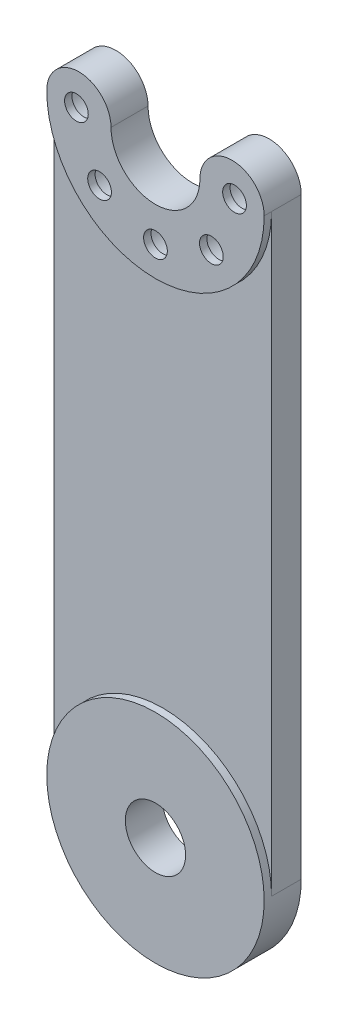
ISO-10303-21;
HEADER;
FILE_DESCRIPTION(('STEP AP214'),'2;1');
FILE_NAME('part.step','',(''),(''),'','','');
FILE_SCHEMA(('AUTOMOTIVE_DESIGN { 1 0 10303 214 1 1 1 1 }'));
ENDSEC;
DATA;
#1=APPLICATION_CONTEXT('core data for automotive mechanical design processes');
#2=APPLICATION_PROTOCOL_DEFINITION('international standard','automotive_design',2000,#1);
#3=PRODUCT_CONTEXT('',#1,'mechanical');
#4=PRODUCT('Part','Part','',(#3));
#5=PRODUCT_RELATED_PRODUCT_CATEGORY('part','',(#4));
#6=PRODUCT_DEFINITION_FORMATION('','',#4);
#7=PRODUCT_DEFINITION_CONTEXT('part definition',#1,'design');
#8=PRODUCT_DEFINITION('design','',#6,#7);
#9=PRODUCT_DEFINITION_SHAPE('','',#8);
#10=(LENGTH_UNIT() NAMED_UNIT(*) SI_UNIT(.MILLI.,.METRE.));
#11=(NAMED_UNIT(*) PLANE_ANGLE_UNIT() SI_UNIT($,.RADIAN.));
#12=(NAMED_UNIT(*) SI_UNIT($,.STERADIAN.) SOLID_ANGLE_UNIT());
#13=UNCERTAINTY_MEASURE_WITH_UNIT(LENGTH_MEASURE(1.E-05),#10,'distance_accuracy_value','');
#14=(GEOMETRIC_REPRESENTATION_CONTEXT(3) GLOBAL_UNCERTAINTY_ASSIGNED_CONTEXT((#13)) GLOBAL_UNIT_ASSIGNED_CONTEXT((#10,
#11,#12)) REPRESENTATION_CONTEXT('',''));
#15=CARTESIAN_POINT('',(0.,0.,0.));
#16=DIRECTION('',(0.,0.,1.));
#17=DIRECTION('',(1.,0.,0.));
#18=AXIS2_PLACEMENT_3D('',#15,#16,#17);
#19=CARTESIAN_POINT('',(-3.87500000000011,0.,0.));
#20=DIRECTION('',(0.,0.,1.));
#21=DIRECTION('',(1.,0.,0.));
#22=AXIS2_PLACEMENT_3D('',#19,#20,#21);
#23=PLANE('',#22);
#24=CARTESIAN_POINT('',(7.99999999999991,0.,0.));
#25=DIRECTION('',(0.,0.,1.));
#26=DIRECTION('',(1.,0.,0.));
#27=AXIS2_PLACEMENT_3D('',#24,#25,#26);
#28=CIRCLE('',#27,1.2);
#29=CARTESIAN_POINT('',(9.19999999999991,0.,0.));
#30=VERTEX_POINT('',#29);
#31=EDGE_CURVE('E287',#30,#30,#28,.T.);
#32=ORIENTED_EDGE('',*,*,#31,.F.);
#33=EDGE_LOOP('',(#32));
#34=FACE_BOUND('',#33,.T.);
#35=CARTESIAN_POINT('',(5.65685424949229,-5.65685424949237,0.));
#36=DIRECTION('',(0.,0.,1.));
#37=DIRECTION('',(1.,0.,0.));
#38=AXIS2_PLACEMENT_3D('',#35,#36,#37);
#39=CIRCLE('',#38,1.2);
#40=CARTESIAN_POINT('',(6.85685424949229,-5.65685424949237,0.));
#41=VERTEX_POINT('',#40);
#42=EDGE_CURVE('E299',#41,#41,#39,.T.);
#43=ORIENTED_EDGE('',*,*,#42,.F.);
#44=EDGE_LOOP('',(#43));
#45=FACE_BOUND('',#44,.T.);
#46=CARTESIAN_POINT('',(0.,-7.99999999999999,0.));
#47=DIRECTION('',(0.,0.,1.));
#48=DIRECTION('',(1.,0.,0.));
#49=AXIS2_PLACEMENT_3D('',#46,#47,#48);
#50=CIRCLE('',#49,1.2);
#51=CARTESIAN_POINT('',(1.19999999999991,-7.99999999999999,0.));
#52=VERTEX_POINT('',#51);
#53=EDGE_CURVE('E311',#52,#52,#50,.T.);
#54=ORIENTED_EDGE('',*,*,#53,.F.);
#55=EDGE_LOOP('',(#54));
#56=FACE_BOUND('',#55,.T.);
#57=CARTESIAN_POINT('',(-5.65685424949247,-5.65685424949237,0.));
#58=DIRECTION('',(0.,0.,1.));
#59=DIRECTION('',(1.,0.,0.));
#60=AXIS2_PLACEMENT_3D('',#57,#58,#59);
#61=CIRCLE('',#60,1.2);
#62=CARTESIAN_POINT('',(-4.45685424949247,-5.65685424949237,0.));
#63=VERTEX_POINT('',#62);
#64=EDGE_CURVE('E323',#63,#63,#61,.T.);
#65=ORIENTED_EDGE('',*,*,#64,.F.);
#66=EDGE_LOOP('',(#65));
#67=FACE_BOUND('',#66,.T.);
#68=CARTESIAN_POINT('',(-8.00000000000009,0.,0.));
#69=DIRECTION('',(0.,0.,1.));
#70=DIRECTION('',(1.,0.,0.));
#71=AXIS2_PLACEMENT_3D('',#68,#69,#70);
#72=CIRCLE('',#71,1.2);
#73=CARTESIAN_POINT('',(-6.80000000000009,0.,0.));
#74=VERTEX_POINT('',#73);
#75=EDGE_CURVE('E138',#74,#74,#72,.T.);
#76=ORIENTED_EDGE('',*,*,#75,.F.);
#77=EDGE_LOOP('',(#76));
#78=FACE_BOUND('',#77,.T.);
#79=CARTESIAN_POINT('',(-7.75000000000013,0.,0.));
#80=DIRECTION('',(0.,0.,1.));
#81=DIRECTION('',(1.,0.,0.));
#82=AXIS2_PLACEMENT_3D('',#79,#80,#81);
#83=CIRCLE('',#82,3.24999999999996);
#84=CARTESIAN_POINT('',(-4.50000000000017,0.,0.));
#85=VERTEX_POINT('',#84);
#86=CARTESIAN_POINT('',(-11.0000000000002,0.,0.));
#87=VERTEX_POINT('',#86);
#88=EDGE_CURVE('E144',#85,#87,#83,.T.);
#89=ORIENTED_EDGE('',*,*,#88,.T.);
#90=CARTESIAN_POINT('',(0.,0.,0.));
#91=DIRECTION('',(0.,0.,1.));
#92=DIRECTION('',(-1.,0.,0.));
#93=AXIS2_PLACEMENT_3D('',#90,#91,#92);
#94=CIRCLE('',#93,11.0000000000001);
#95=CARTESIAN_POINT('',(11.0000000000002,0.,0.));
#96=VERTEX_POINT('',#95);
#97=EDGE_CURVE('E151',#87,#96,#94,.T.);
#98=ORIENTED_EDGE('',*,*,#97,.T.);
#99=CARTESIAN_POINT('',(7.75000000000013,0.,0.));
#100=DIRECTION('',(0.,0.,1.));
#101=DIRECTION('',(1.,0.,0.));
#102=AXIS2_PLACEMENT_3D('',#99,#100,#101);
#103=CIRCLE('',#102,3.25000000000004);
#104=CARTESIAN_POINT('',(4.5,0.,0.));
#105=VERTEX_POINT('',#104);
#106=EDGE_CURVE('E148',#96,#105,#103,.T.);
#107=ORIENTED_EDGE('',*,*,#106,.T.);
#108=CARTESIAN_POINT('',(0.,0.,0.));
#109=DIRECTION('',(0.,0.,-1.));
#110=DIRECTION('',(1.,0.,0.));
#111=AXIS2_PLACEMENT_3D('',#108,#109,#110);
#112=CIRCLE('',#111,4.50000000000009);
#113=EDGE_CURVE('E145',#105,#85,#112,.T.);
#114=ORIENTED_EDGE('',*,*,#113,.T.);
#115=EDGE_LOOP('',(#89,#98,#107,#114));
#116=FACE_BOUND('',#115,.T.);
#117=ADVANCED_FACE('F35',(#34,#45,#56,#67,#78,#116),#23,.T.);
#118=CARTESIAN_POINT('',(0.,0.,-28.9618770789125));
#119=DIRECTION('',(0.,0.,1.));
#120=DIRECTION('',(1.,0.,0.));
#121=AXIS2_PLACEMENT_3D('',#118,#119,#120);
#122=CYLINDRICAL_SURFACE('',#121,11.0000000000001);
#123=DIRECTION('',(0.,0.,1.));
#124=VECTOR('',#123,1.);
#125=CARTESIAN_POINT('',(-11.0000000000002,0.,-28.9618770789125));
#126=LINE('',#125,#124);
#127=CARTESIAN_POINT('',(-11.0000000000002,0.,-0.749999999999987));
#128=VERTEX_POINT('',#127);
#129=EDGE_CURVE('E11',#128,#87,#126,.T.);
#130=ORIENTED_EDGE('',*,*,#129,.F.);
#131=CARTESIAN_POINT('',(0.,0.,-0.749999999999987));
#132=DIRECTION('',(0.,0.,-1.));
#133=DIRECTION('',(-1.,0.,0.));
#134=AXIS2_PLACEMENT_3D('',#131,#132,#133);
#135=CIRCLE('',#134,11.0000000000001);
#136=CARTESIAN_POINT('',(11.0000000000002,0.,-0.749999999999983));
#137=VERTEX_POINT('',#136);
#138=EDGE_CURVE('E95',#128,#137,#135,.F.);
#139=ORIENTED_EDGE('',*,*,#138,.T.);
#140=DIRECTION('',(0.,0.,1.));
#141=VECTOR('',#140,1.);
#142=CARTESIAN_POINT('',(11.0000000000002,0.,-28.9618770789125));
#143=LINE('',#142,#141);
#144=EDGE_CURVE('E67',#137,#96,#143,.T.);
#145=ORIENTED_EDGE('',*,*,#144,.T.);
#146=ORIENTED_EDGE('',*,*,#97,.F.);
#147=EDGE_LOOP('',(#130,#139,#145,#146));
#148=FACE_BOUND('',#147,.T.);
#149=ADVANCED_FACE('F37',(#148),#122,.T.);
#150=CARTESIAN_POINT('',(7.75000000000013,0.,-28.9618770789125));
#151=DIRECTION('',(0.,0.,1.));
#152=DIRECTION('',(1.,0.,0.));
#153=AXIS2_PLACEMENT_3D('',#150,#151,#152);
#154=CYLINDRICAL_SURFACE('',#153,3.25000000000004);
#155=ORIENTED_EDGE('',*,*,#144,.F.);
#156=DIRECTION('',(0.,0.,1.));
#157=VECTOR('',#156,1.);
#158=CARTESIAN_POINT('',(11.0000000000002,0.,-3.74999999999999));
#159=LINE('',#158,#157);
#160=CARTESIAN_POINT('',(11.0000000000002,0.,-3.74999999999999));
#161=VERTEX_POINT('',#160);
#162=EDGE_CURVE('E125',#161,#137,#159,.T.);
#163=ORIENTED_EDGE('',*,*,#162,.F.);
#164=CARTESIAN_POINT('',(7.75000000000013,0.,-3.74999999999999));
#165=DIRECTION('',(0.,0.,-1.));
#166=DIRECTION('',(-1.,0.,0.));
#167=AXIS2_PLACEMENT_3D('',#164,#165,#166);
#168=CIRCLE('',#167,3.25000000000004);
#169=CARTESIAN_POINT('',(4.50000000000009,0.,-3.74999999999999));
#170=VERTEX_POINT('',#169);
#171=EDGE_CURVE('E116',#170,#161,#168,.T.);
#172=ORIENTED_EDGE('',*,*,#171,.F.);
#173=DIRECTION('',(0.,0.,1.));
#174=VECTOR('',#173,1.);
#175=CARTESIAN_POINT('',(4.5,0.,-28.9618770789125));
#176=LINE('',#175,#174);
#177=EDGE_CURVE('E158',#170,#105,#176,.T.);
#178=ORIENTED_EDGE('',*,*,#177,.T.);
#179=ORIENTED_EDGE('',*,*,#106,.F.);
#180=EDGE_LOOP('',(#155,#163,#172,#178,#179));
#181=FACE_BOUND('',#180,.T.);
#182=ADVANCED_FACE('F160',(#181),#154,.T.);
#183=CARTESIAN_POINT('',(0.,0.,-28.9618770789125));
#184=DIRECTION('',(0.,0.,1.));
#185=DIRECTION('',(1.,0.,0.));
#186=AXIS2_PLACEMENT_3D('',#183,#184,#185);
#187=CYLINDRICAL_SURFACE('',#186,4.50000000000009);
#188=ORIENTED_EDGE('',*,*,#177,.F.);
#189=CARTESIAN_POINT('',(0.,0.,-3.74999999999999));
#190=DIRECTION('',(0.,0.,1.));
#191=DIRECTION('',(-1.,0.,0.));
#192=AXIS2_PLACEMENT_3D('',#189,#190,#191);
#193=CIRCLE('',#192,4.50000000000013);
#194=CARTESIAN_POINT('',(-4.50000000000022,0.,-3.74999999999999));
#195=VERTEX_POINT('',#194);
#196=EDGE_CURVE('E338',#195,#170,#193,.T.);
#197=ORIENTED_EDGE('',*,*,#196,.F.);
#198=DIRECTION('',(0.,0.,1.));
#199=VECTOR('',#198,1.);
#200=CARTESIAN_POINT('',(-4.50000000000017,0.,-28.9618770789125));
#201=LINE('',#200,#199);
#202=EDGE_CURVE('E43',#195,#85,#201,.T.);
#203=ORIENTED_EDGE('',*,*,#202,.T.);
#204=ORIENTED_EDGE('',*,*,#113,.F.);
#205=EDGE_LOOP('',(#188,#197,#203,#204));
#206=FACE_BOUND('',#205,.T.);
#207=ADVANCED_FACE('F162',(#206),#187,.F.);
#208=CARTESIAN_POINT('',(-7.75000000000013,0.,-28.9618770789125));
#209=DIRECTION('',(0.,0.,1.));
#210=DIRECTION('',(1.,0.,0.));
#211=AXIS2_PLACEMENT_3D('',#208,#209,#210);
#212=CYLINDRICAL_SURFACE('',#211,3.24999999999996);
#213=ORIENTED_EDGE('',*,*,#202,.F.);
#214=CARTESIAN_POINT('',(-7.75000000000013,0.,-3.74999999999999));
#215=DIRECTION('',(0.,0.,-1.));
#216=DIRECTION('',(-1.,0.,0.));
#217=AXIS2_PLACEMENT_3D('',#214,#215,#216);
#218=CIRCLE('',#217,3.25);
#219=CARTESIAN_POINT('',(-11.0000000000002,0.,-3.74999999999999));
#220=VERTEX_POINT('',#219);
#221=EDGE_CURVE('E140',#220,#195,#218,.T.);
#222=ORIENTED_EDGE('',*,*,#221,.F.);
#223=DIRECTION('',(0.,0.,1.));
#224=VECTOR('',#223,1.);
#225=CARTESIAN_POINT('',(-11.0000000000002,0.,-3.74999999999999));
#226=LINE('',#225,#224);
#227=EDGE_CURVE('E132',#220,#128,#226,.T.);
#228=ORIENTED_EDGE('',*,*,#227,.T.);
#229=ORIENTED_EDGE('',*,*,#129,.T.);
#230=ORIENTED_EDGE('',*,*,#88,.F.);
#231=EDGE_LOOP('',(#213,#222,#228,#229,#230));
#232=FACE_BOUND('',#231,.T.);
#233=ADVANCED_FACE('F164',(#232),#212,.T.);
#234=CARTESIAN_POINT('',(11.0000000000002,0.,-3.74999999999999));
#235=DIRECTION('',(-1.,0.,0.));
#236=DIRECTION('',(0.,0.,1.));
#237=AXIS2_PLACEMENT_3D('',#234,#235,#236);
#238=PLANE('',#237);
#239=DIRECTION('',(0.,-1.,0.));
#240=VECTOR('',#239,1.);
#241=CARTESIAN_POINT('',(11.0000000000002,0.,-0.749999999999987));
#242=LINE('',#241,#240);
#243=CARTESIAN_POINT('',(11.0000000000002,-60.,-0.749999999999987));
#244=VERTEX_POINT('',#243);
#245=EDGE_CURVE('E75',#137,#244,#242,.T.);
#246=ORIENTED_EDGE('',*,*,#245,.T.);
#247=DIRECTION('',(0.,0.,1.));
#248=VECTOR('',#247,1.);
#249=CARTESIAN_POINT('',(11.0000000000002,-60.,-3.74999999999999));
#250=LINE('',#249,#248);
#251=CARTESIAN_POINT('',(11.0000000000002,-60.,-3.74999999999999));
#252=VERTEX_POINT('',#251);
#253=EDGE_CURVE('E121',#252,#244,#250,.T.);
#254=ORIENTED_EDGE('',*,*,#253,.F.);
#255=DIRECTION('',(0.,-1.,0.));
#256=VECTOR('',#255,1.);
#257=CARTESIAN_POINT('',(11.0000000000002,0.,-3.74999999999999));
#258=LINE('',#257,#256);
#259=EDGE_CURVE('E108',#161,#252,#258,.T.);
#260=ORIENTED_EDGE('',*,*,#259,.F.);
#261=ORIENTED_EDGE('',*,*,#162,.T.);
#262=EDGE_LOOP('',(#246,#254,#260,#261));
#263=FACE_BOUND('',#262,.T.);
#264=ADVANCED_FACE('F122',(#263),#238,.F.);
#265=CARTESIAN_POINT('',(0.,-59.9999999999999,-3.74999999999999));
#266=DIRECTION('',(0.,0.,1.));
#267=DIRECTION('',(1.,0.,0.));
#268=AXIS2_PLACEMENT_3D('',#265,#266,#267);
#269=CYLINDRICAL_SURFACE('',#268,11.0000000000002);
#270=ORIENTED_EDGE('',*,*,#253,.T.);
#271=CARTESIAN_POINT('',(0.,-59.9999999999999,-0.749999999999987));
#272=DIRECTION('',(0.,0.,1.));
#273=DIRECTION('',(1.,0.,0.));
#274=AXIS2_PLACEMENT_3D('',#271,#272,#273);
#275=CIRCLE('',#274,11.0000000000002);
#276=CARTESIAN_POINT('',(-11.0000000000002,-59.9999999999999,-0.749999999999987));
#277=VERTEX_POINT('',#276);
#278=EDGE_CURVE('E271',#244,#277,#275,.T.);
#279=ORIENTED_EDGE('',*,*,#278,.T.);
#280=DIRECTION('',(0.,0.,1.));
#281=VECTOR('',#280,1.);
#282=CARTESIAN_POINT('',(-11.0000000000002,-60.,-3.74999999999999));
#283=LINE('',#282,#281);
#284=CARTESIAN_POINT('',(-11.0000000000002,-60.,-3.74999999999999));
#285=VERTEX_POINT('',#284);
#286=EDGE_CURVE('E126',#285,#277,#283,.T.);
#287=ORIENTED_EDGE('',*,*,#286,.F.);
#288=CARTESIAN_POINT('',(0.,-59.9999999999999,-3.74999999999999));
#289=DIRECTION('',(0.,0.,-1.));
#290=DIRECTION('',(-1.,0.,0.));
#291=AXIS2_PLACEMENT_3D('',#288,#289,#290);
#292=CIRCLE('',#291,11.0000000000002);
#293=EDGE_CURVE('E112',#252,#285,#292,.T.);
#294=ORIENTED_EDGE('',*,*,#293,.F.);
#295=EDGE_LOOP('',(#270,#279,#287,#294));
#296=FACE_BOUND('',#295,.T.);
#297=CARTESIAN_POINT('',(0.,-59.9999999999999,0.));
#298=DIRECTION('',(0.,0.,-1.));
#299=DIRECTION('',(0.,1.,0.));
#300=AXIS2_PLACEMENT_3D('',#297,#298,#299);
#301=CIRCLE('',#300,11.0000000000002);
#302=CARTESIAN_POINT('',(0.,-48.9999999999997,0.));
#303=VERTEX_POINT('',#302);
#304=EDGE_CURVE('E275',#303,#303,#301,.T.);
#305=ORIENTED_EDGE('',*,*,#304,.T.);
#306=EDGE_LOOP('',(#305));
#307=FACE_BOUND('',#306,.T.);
#308=ADVANCED_FACE('F128',(#296,#307),#269,.T.);
#309=CARTESIAN_POINT('',(-11.0000000000002,-60.,-3.74999999999999));
#310=DIRECTION('',(1.,0.,0.));
#311=DIRECTION('',(0.,0.,-1.));
#312=AXIS2_PLACEMENT_3D('',#309,#310,#311);
#313=PLANE('',#312);
#314=DIRECTION('',(0.,1.,0.));
#315=VECTOR('',#314,1.);
#316=CARTESIAN_POINT('',(-11.0000000000002,-60.,-0.749999999999987));
#317=LINE('',#316,#315);
#318=EDGE_CURVE('E137',#277,#128,#317,.T.);
#319=ORIENTED_EDGE('',*,*,#318,.T.);
#320=ORIENTED_EDGE('',*,*,#227,.F.);
#321=DIRECTION('',(0.,1.,0.));
#322=VECTOR('',#321,1.);
#323=CARTESIAN_POINT('',(-11.0000000000002,-60.,-3.74999999999999));
#324=LINE('',#323,#322);
#325=EDGE_CURVE('E84',#285,#220,#324,.T.);
#326=ORIENTED_EDGE('',*,*,#325,.F.);
#327=ORIENTED_EDGE('',*,*,#286,.T.);
#328=EDGE_LOOP('',(#319,#320,#326,#327));
#329=FACE_BOUND('',#328,.T.);
#330=ADVANCED_FACE('F184',(#329),#313,.F.);
#331=CARTESIAN_POINT('',(-7.75000000000013,0.,-3.74999999999999));
#332=DIRECTION('',(0.,0.,-1.));
#333=DIRECTION('',(-1.,0.,0.));
#334=AXIS2_PLACEMENT_3D('',#331,#332,#333);
#335=PLANE('',#334);
#336=CARTESIAN_POINT('',(0.,-59.9999999999999,-3.74999999999999));
#337=DIRECTION('',(0.,0.,-1.));
#338=DIRECTION('',(-1.,0.,0.));
#339=AXIS2_PLACEMENT_3D('',#336,#337,#338);
#340=CIRCLE('',#339,3.05);
#341=CARTESIAN_POINT('',(-3.05,-59.9999999999999,-3.74999999999999));
#342=VERTEX_POINT('',#341);
#343=EDGE_CURVE('E269',#342,#342,#340,.T.);
#344=ORIENTED_EDGE('',*,*,#343,.F.);
#345=EDGE_LOOP('',(#344));
#346=FACE_BOUND('',#345,.T.);
#347=CARTESIAN_POINT('',(7.99999999999991,0.,-3.74999999999999));
#348=DIRECTION('',(0.,0.,-1.));
#349=DIRECTION('',(-1.,0.,0.));
#350=AXIS2_PLACEMENT_3D('',#347,#348,#349);
#351=CIRCLE('',#350,2.2);
#352=CARTESIAN_POINT('',(5.79999999999991,0.,-3.74999999999999));
#353=VERTEX_POINT('',#352);
#354=EDGE_CURVE('E278',#353,#353,#351,.T.);
#355=ORIENTED_EDGE('',*,*,#354,.F.);
#356=EDGE_LOOP('',(#355));
#357=FACE_BOUND('',#356,.T.);
#358=CARTESIAN_POINT('',(5.65685424949229,-5.65685424949237,-3.74999999999999));
#359=DIRECTION('',(0.,0.,-1.));
#360=DIRECTION('',(-1.,0.,0.));
#361=AXIS2_PLACEMENT_3D('',#358,#359,#360);
#362=CIRCLE('',#361,2.2);
#363=CARTESIAN_POINT('',(3.45685424949229,-5.65685424949237,-3.74999999999999));
#364=VERTEX_POINT('',#363);
#365=EDGE_CURVE('E290',#364,#364,#362,.T.);
#366=ORIENTED_EDGE('',*,*,#365,.F.);
#367=EDGE_LOOP('',(#366));
#368=FACE_BOUND('',#367,.T.);
#369=CARTESIAN_POINT('',(0.,-7.99999999999999,-3.74999999999999));
#370=DIRECTION('',(0.,0.,-1.));
#371=DIRECTION('',(-1.,0.,0.));
#372=AXIS2_PLACEMENT_3D('',#369,#370,#371);
#373=CIRCLE('',#372,2.2);
#374=CARTESIAN_POINT('',(-2.20000000000009,-7.99999999999999,-3.74999999999999));
#375=VERTEX_POINT('',#374);
#376=EDGE_CURVE('E302',#375,#375,#373,.T.);
#377=ORIENTED_EDGE('',*,*,#376,.F.);
#378=EDGE_LOOP('',(#377));
#379=FACE_BOUND('',#378,.T.);
#380=CARTESIAN_POINT('',(-5.65685424949247,-5.65685424949237,-3.74999999999999));
#381=DIRECTION('',(0.,0.,-1.));
#382=DIRECTION('',(-1.,0.,0.));
#383=AXIS2_PLACEMENT_3D('',#380,#381,#382);
#384=CIRCLE('',#383,2.2);
#385=CARTESIAN_POINT('',(-7.85685424949247,-5.65685424949237,-3.74999999999999));
#386=VERTEX_POINT('',#385);
#387=EDGE_CURVE('E314',#386,#386,#384,.T.);
#388=ORIENTED_EDGE('',*,*,#387,.F.);
#389=EDGE_LOOP('',(#388));
#390=FACE_BOUND('',#389,.T.);
#391=CARTESIAN_POINT('',(-8.00000000000009,0.,-3.74999999999999));
#392=DIRECTION('',(0.,0.,-1.));
#393=DIRECTION('',(-1.,0.,0.));
#394=AXIS2_PLACEMENT_3D('',#391,#392,#393);
#395=CIRCLE('',#394,2.2);
#396=CARTESIAN_POINT('',(-10.2000000000001,0.,-3.74999999999999));
#397=VERTEX_POINT('',#396);
#398=EDGE_CURVE('E326',#397,#397,#395,.T.);
#399=ORIENTED_EDGE('',*,*,#398,.F.);
#400=EDGE_LOOP('',(#399));
#401=FACE_BOUND('',#400,.T.);
#402=ORIENTED_EDGE('',*,*,#221,.T.);
#403=ORIENTED_EDGE('',*,*,#196,.T.);
#404=ORIENTED_EDGE('',*,*,#171,.T.);
#405=ORIENTED_EDGE('',*,*,#259,.T.);
#406=ORIENTED_EDGE('',*,*,#293,.T.);
#407=ORIENTED_EDGE('',*,*,#325,.T.);
#408=EDGE_LOOP('',(#402,#403,#404,#405,#406,#407));
#409=FACE_BOUND('',#408,.T.);
#410=ADVANCED_FACE('F110',(#346,#357,#368,#379,#390,#401,#409),#335,.T.);
#411=CARTESIAN_POINT('',(-7.75000000000013,0.,-0.749999999999987));
#412=DIRECTION('',(0.,0.,-1.));
#413=DIRECTION('',(-1.,0.,0.));
#414=AXIS2_PLACEMENT_3D('',#411,#412,#413);
#415=PLANE('',#414);
#416=ORIENTED_EDGE('',*,*,#278,.F.);
#417=ORIENTED_EDGE('',*,*,#245,.F.);
#418=ORIENTED_EDGE('',*,*,#138,.F.);
#419=ORIENTED_EDGE('',*,*,#318,.F.);
#420=EDGE_LOOP('',(#416,#417,#418,#419));
#421=FACE_BOUND('',#420,.T.);
#422=ADVANCED_FACE('F188',(#421),#415,.F.);
#423=CARTESIAN_POINT('',(-8.00000000000009,0.,-3.74999999999999));
#424=DIRECTION('',(0.,0.,-1.));
#425=DIRECTION('',(-1.,0.,0.));
#426=AXIS2_PLACEMENT_3D('',#423,#424,#425);
#427=CYLINDRICAL_SURFACE('',#426,1.2);
#428=CARTESIAN_POINT('',(-8.00000000000009,0.,-0.749999999999987));
#429=DIRECTION('',(0.,0.,-1.));
#430=DIRECTION('',(-1.,0.,0.));
#431=AXIS2_PLACEMENT_3D('',#428,#429,#430);
#432=CIRCLE('',#431,1.2);
#433=CARTESIAN_POINT('',(-9.20000000000009,0.,-0.749999999999987));
#434=VERTEX_POINT('',#433);
#435=EDGE_CURVE('E332',#434,#434,#432,.T.);
#436=ORIENTED_EDGE('',*,*,#435,.T.);
#437=EDGE_LOOP('',(#436));
#438=FACE_BOUND('',#437,.T.);
#439=ORIENTED_EDGE('',*,*,#75,.T.);
#440=EDGE_LOOP('',(#439));
#441=FACE_BOUND('',#440,.T.);
#442=ADVANCED_FACE('F191',(#438,#441),#427,.F.);
#443=CARTESIAN_POINT('',(-6.80000000000009,0.,-0.749999999999987));
#444=DIRECTION('',(0.,0.,1.));
#445=DIRECTION('',(1.,0.,0.));
#446=AXIS2_PLACEMENT_3D('',#443,#444,#445);
#447=PLANE('',#446);
#448=ORIENTED_EDGE('',*,*,#435,.F.);
#449=EDGE_LOOP('',(#448));
#450=FACE_BOUND('',#449,.T.);
#451=CARTESIAN_POINT('',(-8.00000000000009,0.,-0.749999999999987));
#452=DIRECTION('',(0.,0.,-1.));
#453=DIRECTION('',(-1.,0.,0.));
#454=AXIS2_PLACEMENT_3D('',#451,#452,#453);
#455=CIRCLE('',#454,2.2);
#456=CARTESIAN_POINT('',(-10.2000000000001,0.,-0.749999999999987));
#457=VERTEX_POINT('',#456);
#458=EDGE_CURVE('E329',#457,#457,#455,.T.);
#459=ORIENTED_EDGE('',*,*,#458,.T.);
#460=EDGE_LOOP('',(#459));
#461=FACE_BOUND('',#460,.T.);
#462=ADVANCED_FACE('F197',(#450,#461),#447,.F.);
#463=CARTESIAN_POINT('',(-8.00000000000009,0.,-3.74999999999999));
#464=DIRECTION('',(0.,0.,-1.));
#465=DIRECTION('',(-1.,0.,0.));
#466=AXIS2_PLACEMENT_3D('',#463,#464,#465);
#467=CYLINDRICAL_SURFACE('',#466,2.2);
#468=ORIENTED_EDGE('',*,*,#458,.F.);
#469=EDGE_LOOP('',(#468));
#470=FACE_BOUND('',#469,.T.);
#471=ORIENTED_EDGE('',*,*,#398,.T.);
#472=EDGE_LOOP('',(#471));
#473=FACE_BOUND('',#472,.T.);
#474=ADVANCED_FACE('F201',(#470,#473),#467,.F.);
#475=CARTESIAN_POINT('',(-5.65685424949247,-5.65685424949237,-3.74999999999999));
#476=DIRECTION('',(0.,0.,-1.));
#477=DIRECTION('',(-1.,0.,0.));
#478=AXIS2_PLACEMENT_3D('',#475,#476,#477);
#479=CYLINDRICAL_SURFACE('',#478,1.2);
#480=CARTESIAN_POINT('',(-5.65685424949247,-5.65685424949237,-0.749999999999987));
#481=DIRECTION('',(0.,0.,-1.));
#482=DIRECTION('',(-1.,0.,0.));
#483=AXIS2_PLACEMENT_3D('',#480,#481,#482);
#484=CIRCLE('',#483,1.2);
#485=CARTESIAN_POINT('',(-6.85685424949247,-5.65685424949237,-0.749999999999987));
#486=VERTEX_POINT('',#485);
#487=EDGE_CURVE('E320',#486,#486,#484,.T.);
#488=ORIENTED_EDGE('',*,*,#487,.T.);
#489=EDGE_LOOP('',(#488));
#490=FACE_BOUND('',#489,.T.);
#491=ORIENTED_EDGE('',*,*,#64,.T.);
#492=EDGE_LOOP('',(#491));
#493=FACE_BOUND('',#492,.T.);
#494=ADVANCED_FACE('F205',(#490,#493),#479,.F.);
#495=CARTESIAN_POINT('',(-4.45685424949247,-5.65685424949237,-0.749999999999987));
#496=DIRECTION('',(0.,0.,1.));
#497=DIRECTION('',(1.,0.,0.));
#498=AXIS2_PLACEMENT_3D('',#495,#496,#497);
#499=PLANE('',#498);
#500=ORIENTED_EDGE('',*,*,#487,.F.);
#501=EDGE_LOOP('',(#500));
#502=FACE_BOUND('',#501,.T.);
#503=CARTESIAN_POINT('',(-5.65685424949247,-5.65685424949237,-0.749999999999987));
#504=DIRECTION('',(0.,0.,-1.));
#505=DIRECTION('',(-1.,0.,0.));
#506=AXIS2_PLACEMENT_3D('',#503,#504,#505);
#507=CIRCLE('',#506,2.2);
#508=CARTESIAN_POINT('',(-7.85685424949247,-5.65685424949237,-0.749999999999987));
#509=VERTEX_POINT('',#508);
#510=EDGE_CURVE('E317',#509,#509,#507,.T.);
#511=ORIENTED_EDGE('',*,*,#510,.T.);
#512=EDGE_LOOP('',(#511));
#513=FACE_BOUND('',#512,.T.);
#514=ADVANCED_FACE('F209',(#502,#513),#499,.F.);
#515=CARTESIAN_POINT('',(-5.65685424949247,-5.65685424949237,-3.74999999999999));
#516=DIRECTION('',(0.,0.,-1.));
#517=DIRECTION('',(-1.,0.,0.));
#518=AXIS2_PLACEMENT_3D('',#515,#516,#517);
#519=CYLINDRICAL_SURFACE('',#518,2.2);
#520=ORIENTED_EDGE('',*,*,#510,.F.);
#521=EDGE_LOOP('',(#520));
#522=FACE_BOUND('',#521,.T.);
#523=ORIENTED_EDGE('',*,*,#387,.T.);
#524=EDGE_LOOP('',(#523));
#525=FACE_BOUND('',#524,.T.);
#526=ADVANCED_FACE('F213',(#522,#525),#519,.F.);
#527=CARTESIAN_POINT('',(0.,-7.99999999999999,-3.74999999999999));
#528=DIRECTION('',(0.,0.,-1.));
#529=DIRECTION('',(-1.,0.,0.));
#530=AXIS2_PLACEMENT_3D('',#527,#528,#529);
#531=CYLINDRICAL_SURFACE('',#530,1.2);
#532=CARTESIAN_POINT('',(0.,-7.99999999999999,-0.749999999999987));
#533=DIRECTION('',(0.,0.,-1.));
#534=DIRECTION('',(-1.,0.,0.));
#535=AXIS2_PLACEMENT_3D('',#532,#533,#534);
#536=CIRCLE('',#535,1.2);
#537=CARTESIAN_POINT('',(-1.20000000000009,-7.99999999999999,-0.749999999999987));
#538=VERTEX_POINT('',#537);
#539=EDGE_CURVE('E308',#538,#538,#536,.T.);
#540=ORIENTED_EDGE('',*,*,#539,.T.);
#541=EDGE_LOOP('',(#540));
#542=FACE_BOUND('',#541,.T.);
#543=ORIENTED_EDGE('',*,*,#53,.T.);
#544=EDGE_LOOP('',(#543));
#545=FACE_BOUND('',#544,.T.);
#546=ADVANCED_FACE('F217',(#542,#545),#531,.F.);
#547=CARTESIAN_POINT('',(1.19999999999991,-7.99999999999999,-0.749999999999987));
#548=DIRECTION('',(0.,0.,1.));
#549=DIRECTION('',(1.,0.,0.));
#550=AXIS2_PLACEMENT_3D('',#547,#548,#549);
#551=PLANE('',#550);
#552=ORIENTED_EDGE('',*,*,#539,.F.);
#553=EDGE_LOOP('',(#552));
#554=FACE_BOUND('',#553,.T.);
#555=CARTESIAN_POINT('',(0.,-7.99999999999999,-0.749999999999987));
#556=DIRECTION('',(0.,0.,-1.));
#557=DIRECTION('',(-1.,0.,0.));
#558=AXIS2_PLACEMENT_3D('',#555,#556,#557);
#559=CIRCLE('',#558,2.2);
#560=CARTESIAN_POINT('',(-2.20000000000009,-7.99999999999999,-0.749999999999987));
#561=VERTEX_POINT('',#560);
#562=EDGE_CURVE('E305',#561,#561,#559,.T.);
#563=ORIENTED_EDGE('',*,*,#562,.T.);
#564=EDGE_LOOP('',(#563));
#565=FACE_BOUND('',#564,.T.);
#566=ADVANCED_FACE('F221',(#554,#565),#551,.F.);
#567=CARTESIAN_POINT('',(0.,-7.99999999999999,-3.74999999999999));
#568=DIRECTION('',(0.,0.,-1.));
#569=DIRECTION('',(-1.,0.,0.));
#570=AXIS2_PLACEMENT_3D('',#567,#568,#569);
#571=CYLINDRICAL_SURFACE('',#570,2.2);
#572=ORIENTED_EDGE('',*,*,#562,.F.);
#573=EDGE_LOOP('',(#572));
#574=FACE_BOUND('',#573,.T.);
#575=ORIENTED_EDGE('',*,*,#376,.T.);
#576=EDGE_LOOP('',(#575));
#577=FACE_BOUND('',#576,.T.);
#578=ADVANCED_FACE('F225',(#574,#577),#571,.F.);
#579=CARTESIAN_POINT('',(5.65685424949229,-5.65685424949237,-3.74999999999999));
#580=DIRECTION('',(0.,0.,-1.));
#581=DIRECTION('',(-1.,0.,0.));
#582=AXIS2_PLACEMENT_3D('',#579,#580,#581);
#583=CYLINDRICAL_SURFACE('',#582,1.2);
#584=CARTESIAN_POINT('',(5.65685424949229,-5.65685424949237,-0.749999999999987));
#585=DIRECTION('',(0.,0.,-1.));
#586=DIRECTION('',(-1.,0.,0.));
#587=AXIS2_PLACEMENT_3D('',#584,#585,#586);
#588=CIRCLE('',#587,1.2);
#589=CARTESIAN_POINT('',(4.45685424949229,-5.65685424949237,-0.749999999999987));
#590=VERTEX_POINT('',#589);
#591=EDGE_CURVE('E296',#590,#590,#588,.T.);
#592=ORIENTED_EDGE('',*,*,#591,.T.);
#593=EDGE_LOOP('',(#592));
#594=FACE_BOUND('',#593,.T.);
#595=ORIENTED_EDGE('',*,*,#42,.T.);
#596=EDGE_LOOP('',(#595));
#597=FACE_BOUND('',#596,.T.);
#598=ADVANCED_FACE('F229',(#594,#597),#583,.F.);
#599=CARTESIAN_POINT('',(6.85685424949229,-5.65685424949237,-0.749999999999987));
#600=DIRECTION('',(0.,0.,1.));
#601=DIRECTION('',(1.,0.,0.));
#602=AXIS2_PLACEMENT_3D('',#599,#600,#601);
#603=PLANE('',#602);
#604=ORIENTED_EDGE('',*,*,#591,.F.);
#605=EDGE_LOOP('',(#604));
#606=FACE_BOUND('',#605,.T.);
#607=CARTESIAN_POINT('',(5.65685424949229,-5.65685424949237,-0.749999999999987));
#608=DIRECTION('',(0.,0.,-1.));
#609=DIRECTION('',(-1.,0.,0.));
#610=AXIS2_PLACEMENT_3D('',#607,#608,#609);
#611=CIRCLE('',#610,2.2);
#612=CARTESIAN_POINT('',(3.45685424949229,-5.65685424949237,-0.749999999999987));
#613=VERTEX_POINT('',#612);
#614=EDGE_CURVE('E293',#613,#613,#611,.T.);
#615=ORIENTED_EDGE('',*,*,#614,.T.);
#616=EDGE_LOOP('',(#615));
#617=FACE_BOUND('',#616,.T.);
#618=ADVANCED_FACE('F233',(#606,#617),#603,.F.);
#619=CARTESIAN_POINT('',(5.65685424949229,-5.65685424949237,-3.74999999999999));
#620=DIRECTION('',(0.,0.,-1.));
#621=DIRECTION('',(-1.,0.,0.));
#622=AXIS2_PLACEMENT_3D('',#619,#620,#621);
#623=CYLINDRICAL_SURFACE('',#622,2.2);
#624=ORIENTED_EDGE('',*,*,#614,.F.);
#625=EDGE_LOOP('',(#624));
#626=FACE_BOUND('',#625,.T.);
#627=ORIENTED_EDGE('',*,*,#365,.T.);
#628=EDGE_LOOP('',(#627));
#629=FACE_BOUND('',#628,.T.);
#630=ADVANCED_FACE('F237',(#626,#629),#623,.F.);
#631=CARTESIAN_POINT('',(7.99999999999991,0.,-3.74999999999999));
#632=DIRECTION('',(0.,0.,-1.));
#633=DIRECTION('',(-1.,0.,0.));
#634=AXIS2_PLACEMENT_3D('',#631,#632,#633);
#635=CYLINDRICAL_SURFACE('',#634,1.2);
#636=CARTESIAN_POINT('',(7.99999999999991,0.,-0.749999999999987));
#637=DIRECTION('',(0.,0.,-1.));
#638=DIRECTION('',(-1.,0.,0.));
#639=AXIS2_PLACEMENT_3D('',#636,#637,#638);
#640=CIRCLE('',#639,1.2);
#641=CARTESIAN_POINT('',(6.79999999999991,0.,-0.749999999999987));
#642=VERTEX_POINT('',#641);
#643=EDGE_CURVE('E284',#642,#642,#640,.T.);
#644=ORIENTED_EDGE('',*,*,#643,.T.);
#645=EDGE_LOOP('',(#644));
#646=FACE_BOUND('',#645,.T.);
#647=ORIENTED_EDGE('',*,*,#31,.T.);
#648=EDGE_LOOP('',(#647));
#649=FACE_BOUND('',#648,.T.);
#650=ADVANCED_FACE('F241',(#646,#649),#635,.F.);
#651=CARTESIAN_POINT('',(9.19999999999991,0.,-0.749999999999987));
#652=DIRECTION('',(0.,0.,1.));
#653=DIRECTION('',(1.,0.,0.));
#654=AXIS2_PLACEMENT_3D('',#651,#652,#653);
#655=PLANE('',#654);
#656=ORIENTED_EDGE('',*,*,#643,.F.);
#657=EDGE_LOOP('',(#656));
#658=FACE_BOUND('',#657,.T.);
#659=CARTESIAN_POINT('',(7.99999999999991,0.,-0.749999999999987));
#660=DIRECTION('',(0.,0.,-1.));
#661=DIRECTION('',(-1.,0.,0.));
#662=AXIS2_PLACEMENT_3D('',#659,#660,#661);
#663=CIRCLE('',#662,2.2);
#664=CARTESIAN_POINT('',(5.79999999999991,0.,-0.749999999999987));
#665=VERTEX_POINT('',#664);
#666=EDGE_CURVE('E281',#665,#665,#663,.T.);
#667=ORIENTED_EDGE('',*,*,#666,.T.);
#668=EDGE_LOOP('',(#667));
#669=FACE_BOUND('',#668,.T.);
#670=ADVANCED_FACE('F245',(#658,#669),#655,.F.);
#671=CARTESIAN_POINT('',(7.99999999999991,0.,-3.74999999999999));
#672=DIRECTION('',(0.,0.,-1.));
#673=DIRECTION('',(-1.,0.,0.));
#674=AXIS2_PLACEMENT_3D('',#671,#672,#673);
#675=CYLINDRICAL_SURFACE('',#674,2.2);
#676=ORIENTED_EDGE('',*,*,#666,.F.);
#677=EDGE_LOOP('',(#676));
#678=FACE_BOUND('',#677,.T.);
#679=ORIENTED_EDGE('',*,*,#354,.T.);
#680=EDGE_LOOP('',(#679));
#681=FACE_BOUND('',#680,.T.);
#682=ADVANCED_FACE('F249',(#678,#681),#675,.F.);
#683=CARTESIAN_POINT('',(-1.93350492041448,-61.955520064518,0.));
#684=DIRECTION('',(0.,0.,-1.));
#685=DIRECTION('',(0.711098205279319,-0.70309269833254,0.));
#686=AXIS2_PLACEMENT_3D('',#683,#684,#685);
#687=PLANE('',#686);
#688=CARTESIAN_POINT('',(0.,-59.9999999999999,0.));
#689=DIRECTION('',(0.,0.,-1.));
#690=DIRECTION('',(-1.,0.,0.));
#691=AXIS2_PLACEMENT_3D('',#688,#689,#690);
#692=CIRCLE('',#691,3.05);
#693=CARTESIAN_POINT('',(-3.05,-59.9999999999999,0.));
#694=VERTEX_POINT('',#693);
#695=EDGE_CURVE('E266',#694,#694,#692,.T.);
#696=ORIENTED_EDGE('',*,*,#695,.T.);
#697=EDGE_LOOP('',(#696));
#698=FACE_BOUND('',#697,.T.);
#699=ORIENTED_EDGE('',*,*,#304,.F.);
#700=EDGE_LOOP('',(#699));
#701=FACE_BOUND('',#700,.T.);
#702=ADVANCED_FACE('F253',(#698,#701),#687,.F.);
#703=CARTESIAN_POINT('',(0.,-59.9999999999999,0.));
#704=DIRECTION('',(0.,0.,-1.));
#705=DIRECTION('',(-1.,0.,0.));
#706=AXIS2_PLACEMENT_3D('',#703,#704,#705);
#707=CYLINDRICAL_SURFACE('',#706,3.05);
#708=ORIENTED_EDGE('',*,*,#695,.F.);
#709=EDGE_LOOP('',(#708));
#710=FACE_BOUND('',#709,.T.);
#711=ORIENTED_EDGE('',*,*,#343,.T.);
#712=EDGE_LOOP('',(#711));
#713=FACE_BOUND('',#712,.T.);
#714=ADVANCED_FACE('F257',(#710,#713),#707,.F.);
#715=CLOSED_SHELL('',(#117,#149,#182,#207,#233,#264,#308,#330,#410,#422,#442,#462,#474,#494,
#514,#526,#546,#566,#578,#598,#618,#630,#650,#670,#682,#702,#714));
#716=MANIFOLD_SOLID_BREP('B2',#715);
#717=ADVANCED_BREP_SHAPE_REPRESENTATION('',(#18,#716),#14);
#718=SHAPE_DEFINITION_REPRESENTATION(#9,#717);
ENDSEC;
END-ISO-10303-21;
